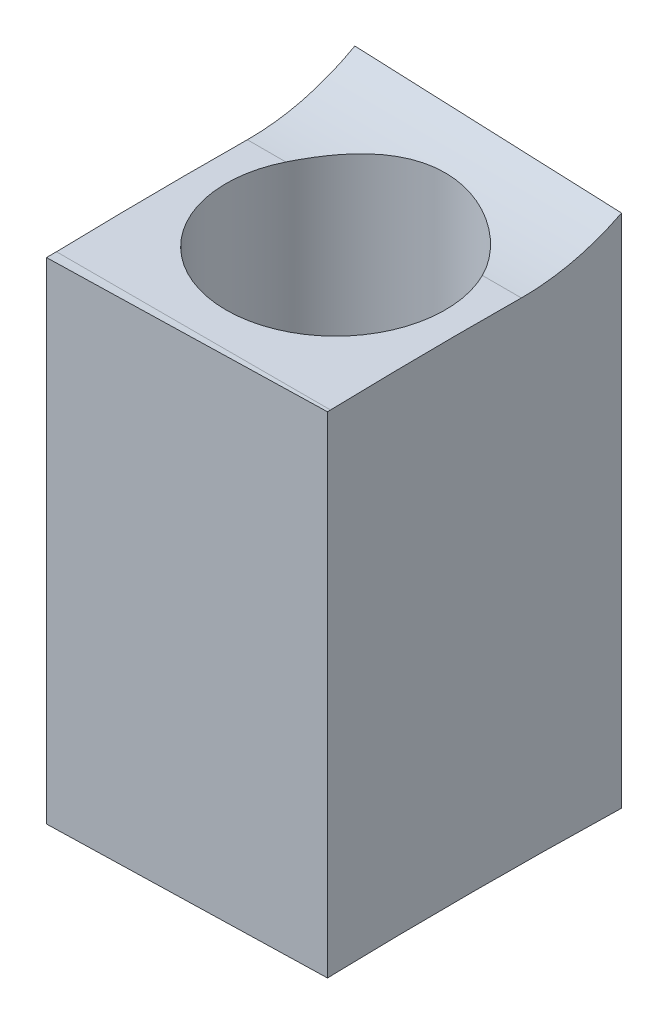
ISO-10303-21;
HEADER;
FILE_DESCRIPTION(('STEP AP214'),'2;1');
FILE_NAME('part.step','',(''),(''),'','','');
FILE_SCHEMA(('AUTOMOTIVE_DESIGN { 1 0 10303 214 1 1 1 1 }'));
ENDSEC;
DATA;
#1=APPLICATION_CONTEXT('core data for automotive mechanical design processes');
#2=APPLICATION_PROTOCOL_DEFINITION('international standard','automotive_design',2000,#1);
#3=PRODUCT_CONTEXT('',#1,'mechanical');
#4=PRODUCT('Part','Part','',(#3));
#5=PRODUCT_RELATED_PRODUCT_CATEGORY('part','',(#4));
#6=PRODUCT_DEFINITION_FORMATION('','',#4);
#7=PRODUCT_DEFINITION_CONTEXT('part definition',#1,'design');
#8=PRODUCT_DEFINITION('design','',#6,#7);
#9=PRODUCT_DEFINITION_SHAPE('','',#8);
#10=(LENGTH_UNIT() NAMED_UNIT(*) SI_UNIT(.MILLI.,.METRE.));
#11=(NAMED_UNIT(*) PLANE_ANGLE_UNIT() SI_UNIT($,.RADIAN.));
#12=(NAMED_UNIT(*) SI_UNIT($,.STERADIAN.) SOLID_ANGLE_UNIT());
#13=UNCERTAINTY_MEASURE_WITH_UNIT(LENGTH_MEASURE(1.E-05),#10,'distance_accuracy_value','');
#14=(GEOMETRIC_REPRESENTATION_CONTEXT(3) GLOBAL_UNCERTAINTY_ASSIGNED_CONTEXT((#13)) GLOBAL_UNIT_ASSIGNED_CONTEXT((#10,
#11,#12)) REPRESENTATION_CONTEXT('',''));
#15=CARTESIAN_POINT('',(0.,0.,0.));
#16=DIRECTION('',(0.,0.,1.));
#17=DIRECTION('',(1.,0.,0.));
#18=AXIS2_PLACEMENT_3D('',#15,#16,#17);
#19=CARTESIAN_POINT('',(-140.97,11.3649926426397,2.12160022973724E-13));
#20=DIRECTION('',(0.,1.,0.));
#21=DIRECTION('',(0.,0.,1.));
#22=AXIS2_PLACEMENT_3D('',#19,#20,#21);
#23=PLANE('',#22);
#24=CARTESIAN_POINT('',(-133.35,11.3649926426397,0.));
#25=DIRECTION('',(0.,1.,0.));
#26=DIRECTION('',(0.,0.,1.));
#27=AXIS2_PLACEMENT_3D('',#24,#25,#26);
#28=CIRCLE('',#27,2.53999999999998);
#29=CARTESIAN_POINT('',(-135.627407566636,11.3649926426397,-1.12472875637992));
#30=VERTEX_POINT('',#29);
#31=CARTESIAN_POINT('',(-131.072592433364,11.3649926426397,-1.12472875637992));
#32=VERTEX_POINT('',#31);
#33=EDGE_CURVE('E1041',#30,#32,#28,.T.);
#34=ORIENTED_EDGE('',*,*,#33,.F.);
#35=DIRECTION('',(1.,0.,0.));
#36=VECTOR('',#35,1.);
#37=CARTESIAN_POINT('',(-140.97,11.3649926426397,-1.12472875637992));
#38=LINE('',#37,#36);
#39=CARTESIAN_POINT('',(-136.520367016151,11.3649926426397,-1.12472875637992));
#40=VERTEX_POINT('',#39);
#41=EDGE_CURVE('E1098',#40,#30,#38,.T.);
#42=ORIENTED_EDGE('',*,*,#41,.F.);
#43=CARTESIAN_POINT('',(0.,11.3649926426397,0.));
#44=DIRECTION('',(0.,1.,0.));
#45=DIRECTION('',(0.,0.,1.));
#46=AXIS2_PLACEMENT_3D('',#43,#44,#45);
#47=CIRCLE('',#46,136.525);
#48=CARTESIAN_POINT('',(-136.484243401375,11.3649926426396,3.33570504602761));
#49=VERTEX_POINT('',#48);
#50=EDGE_CURVE('E1094',#40,#49,#47,.T.);
#51=ORIENTED_EDGE('',*,*,#50,.T.);
#52=DIRECTION('',(1.,0.,0.));
#53=VECTOR('',#52,1.);
#54=CARTESIAN_POINT('',(-140.97,11.3649926426396,3.33570504602761));
#55=LINE('',#54,#53);
#56=CARTESIAN_POINT('',(-130.132254636758,11.3649926426396,3.33570504602761));
#57=VERTEX_POINT('',#56);
#58=EDGE_CURVE('E1044',#49,#57,#55,.T.);
#59=ORIENTED_EDGE('',*,*,#58,.T.);
#60=CARTESIAN_POINT('',(0.,11.3649926426397,0.));
#61=DIRECTION('',(0.,1.,0.));
#62=DIRECTION('',(0.,0.,1.));
#63=AXIS2_PLACEMENT_3D('',#60,#61,#62);
#64=CIRCLE('',#63,130.175);
#65=CARTESIAN_POINT('',(-130.170141008699,11.3649926426397,-1.12472875637992));
#66=VERTEX_POINT('',#65);
#67=EDGE_CURVE('E1035',#66,#57,#64,.T.);
#68=ORIENTED_EDGE('',*,*,#67,.F.);
#69=EDGE_CURVE('E1095',#32,#66,#38,.T.);
#70=ORIENTED_EDGE('',*,*,#69,.F.);
#71=EDGE_LOOP('',(#34,#42,#51,#59,#68,#70));
#72=FACE_BOUND('',#71,.T.);
#73=ADVANCED_FACE('F957',(#72),#23,.T.);
#74=CARTESIAN_POINT('',(-133.35,25.4,0.));
#75=DIRECTION('',(0.,-1.,0.));
#76=DIRECTION('',(0.,0.,-1.));
#77=AXIS2_PLACEMENT_3D('',#74,#75,#76);
#78=CYLINDRICAL_SURFACE('',#77,2.53999999999998);
#79=ORIENTED_EDGE('',*,*,#33,.T.);
#80=CARTESIAN_POINT('',(-133.35,11.5801402748347,-2.53999999999998));
#81=CARTESIAN_POINT('',(-133.489774137144,11.5801305590268,-2.53999040533164));
#82=CARTESIAN_POINT('',(-133.629757827464,11.5764803282047,-2.52840243560373));
#83=CARTESIAN_POINT('',(-133.905830418461,11.562553519904,-2.48240515171614));
#84=CARTESIAN_POINT('',(-134.041907862156,11.5522591907938,-2.4479346933045));
#85=CARTESIAN_POINT('',(-134.305797903615,11.5270518636434,-2.35742334855067));
#86=CARTESIAN_POINT('',(-134.433632526065,11.5121518474014,-2.30144298453229));
#87=CARTESIAN_POINT('',(-134.678212653978,11.4805123611901,-2.16950801297298));
#88=CARTESIAN_POINT('',(-134.794961169526,11.4637733932085,-2.0935588485648));
#89=CARTESIAN_POINT('',(-135.017909180039,11.4311826078722,-1.92097161791698));
#90=CARTESIAN_POINT('',(-135.123691403957,11.4153720099009,-1.8237851768407));
#91=CARTESIAN_POINT('',(-135.317677741705,11.3888518228688,-1.61257291249111));
#92=CARTESIAN_POINT('',(-135.40588343651,11.3781417749026,-1.49854860536014));
#93=CARTESIAN_POINT('',(-135.56044601755,11.3654117935713,-1.25913899581737));
#94=CARTESIAN_POINT('',(-135.627187793943,11.3632298953813,-1.1340120783334));
#95=CARTESIAN_POINT('',(-135.738821113147,11.3697993323867,-0.874659353051798));
#96=CARTESIAN_POINT('',(-135.783727597472,11.3785431766177,-0.740439839016499));
#97=CARTESIAN_POINT('',(-135.847973658182,11.4073907776832,-0.478097247090377));
#98=CARTESIAN_POINT('',(-135.868990823324,11.4265848137544,-0.350281441296535));
#99=CARTESIAN_POINT('',(-135.89145223995,11.4758212781879,-0.0950454129272551));
#100=CARTESIAN_POINT('',(-135.892896492607,11.5058637059,0.0323748096718966));
#101=CARTESIAN_POINT('',(-135.877372269699,11.5756356948728,0.281911635229959));
#102=CARTESIAN_POINT('',(-135.86059008454,11.6152640887161,0.404068876194963));
#103=CARTESIAN_POINT('',(-135.81058695655,11.7029105755913,0.641779505340714));
#104=CARTESIAN_POINT('',(-135.777361621862,11.7509309078367,0.757331119999226));
#105=CARTESIAN_POINT('',(-135.691920854942,11.859131781195,0.992100489034013));
#106=CARTESIAN_POINT('',(-135.638038056027,11.9200661126171,1.11035920522736));
#107=CARTESIAN_POINT('',(-135.514574306174,12.0474185247218,1.33517615412265));
#108=CARTESIAN_POINT('',(-135.444979392533,12.1138414493988,1.44172385374207));
#109=CARTESIAN_POINT('',(-135.278220976172,12.2613716601777,1.66001163116803));
#110=CARTESIAN_POINT('',(-135.178358860913,12.3429991732633,1.76934031883085));
#111=CARTESIAN_POINT('',(-134.960601593178,12.504943931411,1.96963694851819));
#112=CARTESIAN_POINT('',(-134.842701704637,12.5852608262053,2.060600053815));
#113=CARTESIAN_POINT('',(-134.617692744727,12.7204927764356,2.20411305644432));
#114=CARTESIAN_POINT('',(-134.514148491088,12.7770510697038,2.26069945596008));
#115=CARTESIAN_POINT('',(-134.296277052084,12.8806522921458,2.36017754139071));
#116=CARTESIAN_POINT('',(-134.181972553254,12.9277146113573,2.4030972394702));
#117=CARTESIAN_POINT('',(-133.972137912275,12.9968491751983,2.46443435486729));
#118=CARTESIAN_POINT('',(-133.878711916091,13.0222099523155,2.48626293205306));
#119=CARTESIAN_POINT('',(-133.687632638,13.0610630630849,2.51931867356636));
#120=CARTESIAN_POINT('',(-133.589986101204,13.0745736492993,2.53056214384447));
#121=CARTESIAN_POINT('',(-133.392562023033,13.0878022485305,2.541574158814));
#122=CARTESIAN_POINT('',(-133.292776098547,13.0874488929168,2.54128332728426));
#123=CARTESIAN_POINT('',(-133.094931690226,13.0728313021907,2.52910853272517));
#124=CARTESIAN_POINT('',(-132.996874757335,13.0585551659326,2.51721465144551));
#125=CARTESIAN_POINT('',(-132.788561243328,13.0146727383882,2.47981079344584));
#126=CARTESIAN_POINT('',(-132.679152112285,12.9828305548844,2.45229110290641));
#127=CARTESIAN_POINT('',(-132.468467260088,12.9075789780679,2.38470327946712));
#128=CARTESIAN_POINT('',(-132.367211447273,12.8641423260775,2.34460553604981));
#129=CARTESIAN_POINT('',(-132.131829155496,12.749839093771,2.23407310517439));
#130=CARTESIAN_POINT('',(-132.002207095845,12.6751938712518,2.15800130174267));
#131=CARTESIAN_POINT('',(-131.760424614274,12.5199902689609,1.98666606644497));
#132=CARTESIAN_POINT('',(-131.648287885412,12.4394240797946,1.89137698859371));
#133=CARTESIAN_POINT('',(-131.439039490235,12.2761268137448,1.68003897167672));
#134=CARTESIAN_POINT('',(-131.342434038987,12.1933980201867,1.56348520423342));
#135=CARTESIAN_POINT('',(-131.170195915477,12.0332869303372,1.31268103511606));
#136=CARTESIAN_POINT('',(-131.094535291176,11.9558976128497,1.17845457532452));
#137=CARTESIAN_POINT('',(-130.977164674597,11.8221441587322,0.915778100473246));
#138=CARTESIAN_POINT('',(-130.932032816276,11.7643744232231,0.789581692837605));
#139=CARTESIAN_POINT('',(-130.861752639875,11.6586586640589,0.527786472712457));
#140=CARTESIAN_POINT('',(-130.836594006562,11.6107075790396,0.392192552992179));
#141=CARTESIAN_POINT('',(-130.808698523048,11.5266320167139,0.114100762202907));
#142=CARTESIAN_POINT('',(-130.806104325376,11.4905841671185,-0.0284353126448869));
#143=CARTESIAN_POINT('',(-130.825493383945,11.4321281553367,-0.314636513062298));
#144=CARTESIAN_POINT('',(-130.847463380898,11.4097126447511,-0.458300987996079));
#145=CARTESIAN_POINT('',(-130.912395366596,11.3800486113695,-0.725611511346704));
#146=CARTESIAN_POINT('',(-130.952807905702,11.3714130871605,-0.849732560429533));
#147=CARTESIAN_POINT('',(-131.052326967335,11.3635917835181,-1.09053583326177));
#148=CARTESIAN_POINT('',(-131.111433774441,11.3644061479448,-1.20721794373751));
#149=CARTESIAN_POINT('',(-131.246280114003,11.3734446032365,-1.42924782129311));
#150=CARTESIAN_POINT('',(-131.32192304465,11.3816264858342,-1.53465633080222));
#151=CARTESIAN_POINT('',(-131.488046882824,11.4028788605753,-1.73246258969894));
#152=CARTESIAN_POINT('',(-131.578531110159,11.4159504473232,-1.82485741947698));
#153=CARTESIAN_POINT('',(-131.779397202896,11.4453833772517,-2.0009817604865));
#154=CARTESIAN_POINT('',(-131.890753196551,11.461915999123,-2.08357364276249));
#155=CARTESIAN_POINT('',(-132.12552961673,11.4943373307467,-2.22966900132229));
#156=CARTESIAN_POINT('',(-132.248959707553,11.5102255100488,-2.29315701814712));
#157=CARTESIAN_POINT('',(-132.510051569263,11.5389432798317,-2.40141309745329));
#158=CARTESIAN_POINT('',(-132.648082693622,11.551627474251,-2.44534380759793));
#159=CARTESIAN_POINT('',(-132.859188927557,11.5658033916716,-2.49317573573641));
#160=CARTESIAN_POINT('',(-132.930175840945,11.5697191028787,-2.5061058800032));
#161=CARTESIAN_POINT('',(-133.07305707682,11.57575784178,-2.52588335421378));
#162=CARTESIAN_POINT('',(-133.144950791416,11.5778820117371,-2.53273456015338));
#163=CARTESIAN_POINT('',(-133.261283715701,11.5797796149456,-2.53883942305488));
#164=CARTESIAN_POINT('',(-133.305631300279,11.5801433589371,-2.54000304564896));
#165=CARTESIAN_POINT('',(-133.35,11.5801402748347,-2.53999999999998));
#166=B_SPLINE_CURVE_WITH_KNOTS('',3,(#80,#81,#82,#83,#84,#85,#86,#87,#88,#89,#90,#91,#92,#93,
#94,#95,#96,#97,#98,#99,#100,#101,#102,#103,#104,#105,#106,#107,#108,#109,#110,#111,#112,#113,
#114,#115,#116,#117,#118,#119,#120,#121,#122,#123,#124,#125,#126,#127,#128,#129,#130,#131,#132,
#133,#134,#135,#136,#137,#138,#139,#140,#141,#142,#143,#144,#145,#146,#147,#148,#149,#150,#151,
#152,#153,#154,#155,#156,#157,#158,#159,#160,#161,#162,#163,#164,#165),.UNSPECIFIED.,.T.,.F.,(4,
2,2,2,2,2,2,2,2,2,2,2,2,2,2,2,2,2,2,2,2,2,2,2,2,2,2,2,2,2,2,2,2,2,2,2,2,2,2,2,2,2,4),(0.,
0.419171646418358,0.839467893541933,1.25859011381615,1.67759820720509,2.1090743766244,
2.540511718033,2.96371429703728,3.38662687683008,3.77753601545947,4.16844513065484,
4.55539608708564,4.94245045138999,5.37143709487362,5.80080647212805,6.30607393304219,
6.81147428723948,7.20287218831838,7.59346261225419,7.89003003305491,8.18613985198362,
8.48377418044855,8.78166314892409,9.1314040477119,9.48197454454403,9.98274948906855,
10.4841972073637,10.99962889533,11.514369357932,11.9504231598981,12.3862516137612,
12.8248333911119,13.2631785445726,13.6537390266605,14.0443054544437,14.4326484769982,
14.8210784857226,15.2380858189972,15.6554297059883,16.0892385757684,16.3057967089381,
16.5222166629033,16.6552749045156),.UNSPECIFIED.);
#167=EDGE_CURVE('E1043',#32,#30,#166,.T.);
#168=ORIENTED_EDGE('',*,*,#167,.T.);
#169=EDGE_LOOP('',(#79,#168));
#170=FACE_BOUND('',#169,.T.);
#171=CARTESIAN_POINT('',(-133.35,0.,0.));
#172=DIRECTION('',(0.,-1.,0.));
#173=DIRECTION('',(0.,0.,1.));
#174=AXIS2_PLACEMENT_3D('',#171,#172,#173);
#175=CIRCLE('',#174,2.53999999999998);
#176=CARTESIAN_POINT('',(-133.35,0.,2.53999999999998));
#177=VERTEX_POINT('',#176);
#178=EDGE_CURVE('E1050',#177,#177,#175,.T.);
#179=ORIENTED_EDGE('',*,*,#178,.T.);
#180=EDGE_LOOP('',(#179));
#181=FACE_BOUND('',#180,.T.);
#182=ADVANCED_FACE('F1055',(#170,#181),#78,.F.);
#183=CARTESIAN_POINT('',(-140.97,16.1274926426397,-1.12472875637984));
#184=DIRECTION('',(1.,0.,0.));
#185=DIRECTION('',(0.,0.,-1.));
#186=AXIS2_PLACEMENT_3D('',#183,#184,#185);
#187=CYLINDRICAL_SURFACE('',#186,4.7625);
#188=CARTESIAN_POINT('',(-42.9516583332053,16.1274926426397,-1.12472875637984));
#189=DIRECTION('',(-0.0261769483078736,0.,0.999657324975557));
#190=DIRECTION('',(0.999657324975557,0.,0.0261769483078736));
#191=AXIS2_PLACEMENT_3D('',#188,#189,#190);
#192=ELLIPSE('',#191,181.934881942198,4.7625);
#193=CARTESIAN_POINT('',(-136.478216292288,12.0429586721191,-3.57380786773244));
#194=VERTEX_POINT('',#193);
#195=CARTESIAN_POINT('',(-130.130392278693,11.9477824776146,-3.40758424597744));
#196=VERTEX_POINT('',#195);
#197=EDGE_CURVE('E1016',#194,#196,#192,.T.);
#198=ORIENTED_EDGE('',*,*,#197,.F.);
#199=CARTESIAN_POINT('',(-136.451070508352,19.4950886880406,-4.49232480178079));
#200=CARTESIAN_POINT('',(-136.447952615226,19.4004068125719,-4.58702691016241));
#201=CARTESIAN_POINT('',(-136.444868266467,19.3017120408299,-4.67771448429911));
#202=CARTESIAN_POINT('',(-136.4388366071,19.0970424502135,-4.85046028836146));
#203=CARTESIAN_POINT('',(-136.435889290441,18.9910679533088,-4.93251889952567));
#204=CARTESIAN_POINT('',(-136.430203278788,18.7726499893024,-5.08736263673596));
#205=CARTESIAN_POINT('',(-136.427464444145,18.660210942575,-5.16015399266636));
#206=CARTESIAN_POINT('',(-136.422258058328,18.4296003814945,-5.29601310278892));
#207=CARTESIAN_POINT('',(-136.419790503606,18.3114289421524,-5.35908098417212));
#208=CARTESIAN_POINT('',(-136.415184970939,18.0701527012153,-5.47506216636775));
#209=CARTESIAN_POINT('',(-136.413047094429,17.9470463958937,-5.52797234310444));
#210=CARTESIAN_POINT('',(-136.409152589972,17.6967629303313,-5.6232544669249));
#211=CARTESIAN_POINT('',(-136.407396103168,17.5695842829356,-5.66562251348886));
#212=CARTESIAN_POINT('',(-136.404308823968,17.3121779398713,-5.73947085519832));
#213=CARTESIAN_POINT('',(-136.402977788736,17.1819520292176,-5.77095736206461));
#214=CARTESIAN_POINT('',(-136.400771966363,16.9192588842423,-5.82286079936625));
#215=CARTESIAN_POINT('',(-136.399897347686,16.7867908409433,-5.84327364259472));
#216=CARTESIAN_POINT('',(-136.398627042529,16.5207281760041,-5.87285159228658));
#217=CARTESIAN_POINT('',(-136.398230906982,16.3871347293697,-5.88202724521889));
#218=CARTESIAN_POINT('',(-136.397925589575,16.1196017681208,-5.88910272208295));
#219=CARTESIAN_POINT('',(-136.398016587659,15.9856621438936,-5.88699837924928));
#220=CARTESIAN_POINT('',(-136.398683948114,15.7184608590036,-5.87151669726734));
#221=CARTESIAN_POINT('',(-136.399260193921,15.5851990432557,-5.85814206538828));
#222=CARTESIAN_POINT('',(-136.40088306448,15.3202587769564,-5.82022846218996));
#223=CARTESIAN_POINT('',(-136.40192986524,15.1885809378226,-5.79568531330926));
#224=CARTESIAN_POINT('',(-136.405740018278,14.7975731948264,-5.70556834084457));
#225=CARTESIAN_POINT('',(-136.409174244328,14.5418626710235,-5.62348301798864));
#226=CARTESIAN_POINT('',(-136.417507536408,14.0478824398872,-5.41754087762888));
#227=CARTESIAN_POINT('',(-136.422406603812,13.8096127489167,-5.29368402093571));
#228=CARTESIAN_POINT('',(-136.430497143381,13.4704114248379,-5.07938572575286));
#229=CARTESIAN_POINT('',(-136.433320398368,13.3602912128607,-5.00312279220522));
#230=CARTESIAN_POINT('',(-136.439147451389,13.1468772242993,-4.84161131198386));
#231=CARTESIAN_POINT('',(-136.442151181662,13.0435809158337,-4.75636612881716));
#232=CARTESIAN_POINT('',(-136.448270206945,12.8445160189192,-4.57746557911666));
#233=CARTESIAN_POINT('',(-136.45138553002,12.7487493438799,-4.4838080877412));
#234=CARTESIAN_POINT('',(-136.457654065824,12.5654747710411,-4.28879739056907));
#235=CARTESIAN_POINT('',(-136.46080726416,12.4779638413882,-4.18744703478198));
#236=CARTESIAN_POINT('',(-136.467084480793,12.3116932351567,-3.97762538758907));
#237=CARTESIAN_POINT('',(-136.470208463627,12.2329431794517,-3.869146471727));
#238=CARTESIAN_POINT('',(-136.476352990165,12.0848902128412,-3.64597764938229));
#239=CARTESIAN_POINT('',(-136.479373571605,12.015583827287,-3.53129004910699));
#240=CARTESIAN_POINT('',(-136.485248477515,11.8868426591042,-3.29641893296185));
#241=CARTESIAN_POINT('',(-136.488102713181,11.8274131184296,-3.17623254158679));
#242=CARTESIAN_POINT('',(-136.493582216723,11.7189137716147,-2.93131957313633));
#243=CARTESIAN_POINT('',(-136.496207570122,11.6698400861691,-2.80659471677163));
#244=CARTESIAN_POINT('',(-136.501141871921,11.5830072552342,-2.55528005439978));
#245=CARTESIAN_POINT('',(-136.503454845055,11.545094825905,-2.42874325936887));
#246=CARTESIAN_POINT('',(-136.507766334441,11.4799068704214,-2.17295317570505));
#247=CARTESIAN_POINT('',(-136.509764851393,11.4526313206063,-2.04369989311538));
#248=CARTESIAN_POINT('',(-136.513414827577,11.4088980573806,-1.78329085635949));
#249=CARTESIAN_POINT('',(-136.515066075948,11.3924469036851,-1.65213399771295));
#250=CARTESIAN_POINT('',(-136.517999025787,11.370487043849,-1.38889562540496));
#251=CARTESIAN_POINT('',(-136.519280704895,11.3649789996838,-1.25681405629049));
#252=CARTESIAN_POINT('',(-136.520367016151,11.3649926426397,-1.12472875637992));
#253=B_SPLINE_CURVE_WITH_KNOTS('',3,(#199,#200,#201,#202,#203,#204,#205,#206,#207,#208,#209,
#210,#211,#212,#213,#214,#215,#216,#217,#218,#219,#220,#221,#222,#223,#224,#225,#226,#227,#228,
#229,#230,#231,#232,#233,#234,#235,#236,#237,#238,#239,#240,#241,#242,#243,#244,#245,#246,#247,
#248,#249,#250,#251,#252),.UNSPECIFIED.,.F.,.F.,(4,2,2,2,2,2,2,2,2,2,2,2,2,2,2,2,2,2,2,2,2,2,2,
2,2,2,4),(0.,0.401730642081915,0.80344352773037,1.20488492091714,1.60632106247464,
2.00788047152683,2.409588234765,2.81106630309802,3.21269245335414,3.61394137480853,
4.01533852551304,4.41663928290678,4.81809026958719,5.61978649559305,6.42148347373892,
6.82302419526842,7.22441508602687,7.62590764965578,8.02725218980788,8.4290332096778,
8.83066599909839,9.23251127170541,9.63420574473339,10.0300942938491,10.4259819623461,
10.8221093231283,11.2182606458896),.UNSPECIFIED.);
#254=EDGE_CURVE('E1078',#194,#40,#253,.T.);
#255=ORIENTED_EDGE('',*,*,#254,.T.);
#256=ORIENTED_EDGE('',*,*,#41,.T.);
#257=ORIENTED_EDGE('',*,*,#167,.F.);
#258=ORIENTED_EDGE('',*,*,#69,.T.);
#259=CARTESIAN_POINT('',(-130.097462092369,19.4950886880406,-4.49232480178079));
#260=CARTESIAN_POINT('',(-130.094192009814,19.4004091069371,-4.587024602308));
#261=CARTESIAN_POINT('',(-130.090957093606,19.3017167725189,-4.67771013995367));
#262=CARTESIAN_POINT('',(-130.084630955571,19.0970520928856,-4.8504524996695));
#263=CARTESIAN_POINT('',(-130.081539727451,18.9910800669492,-4.93250969976958));
#264=CARTESIAN_POINT('',(-130.07557603343,18.7726665251111,-5.08735152578895));
#265=CARTESIAN_POINT('',(-130.072703421831,18.6602294071688,-5.16014234943486));
#266=CARTESIAN_POINT('',(-130.067242699074,18.4296223474737,-5.29600092698724));
#267=CARTESIAN_POINT('',(-130.064654584167,18.311452481267,-5.3590688089767));
#268=CARTESIAN_POINT('',(-130.059823997775,18.0701786377911,-5.47505055878217));
#269=CARTESIAN_POINT('',(-130.057581633394,17.9470731464218,-5.5279612814282));
#270=CARTESIAN_POINT('',(-130.053496761611,17.6967907327375,-5.62324476059497));
#271=CARTESIAN_POINT('',(-130.051654402239,17.5696123230616,-5.66561361671161));
#272=CARTESIAN_POINT('',(-130.048416172319,17.3122060761688,-5.73946363462126));
#273=CARTESIAN_POINT('',(-130.047020046459,17.1819800285881,-5.7709510230447));
#274=CARTESIAN_POINT('',(-130.044706337997,16.9192861526372,-5.82285621860721));
#275=CARTESIAN_POINT('',(-130.043788932078,16.7868175151756,-5.84326993882059));
#276=CARTESIAN_POINT('',(-130.042456504641,16.5207613377183,-5.87284864323656));
#277=CARTESIAN_POINT('',(-130.042040982075,16.3871750479321,-5.88202484635201));
#278=CARTESIAN_POINT('',(-130.041720637759,16.1196562641624,-5.88910261359721));
#279=CARTESIAN_POINT('',(-130.041816004725,15.9857236605171,-5.88700001150617));
#280=CARTESIAN_POINT('',(-130.042515773722,15.718536301756,-5.87152299811448));
#281=CARTESIAN_POINT('',(-130.04312005353,15.5852813916114,-5.85815129326227));
#282=CARTESIAN_POINT('',(-130.04482193041,15.3203548335308,-5.82024476706954));
#283=CARTESIAN_POINT('',(-130.045919712074,15.1886837969775,-5.79570576859405));
#284=CARTESIAN_POINT('',(-130.049915366043,14.7977057165116,-5.70560535573897));
#285=CARTESIAN_POINT('',(-130.053516753337,14.5420175403841,-5.62353597858792));
#286=CARTESIAN_POINT('',(-130.062255656872,14.0480789775841,-5.41763441183327));
#287=CARTESIAN_POINT('',(-130.067393174978,13.809828612094,-5.29380217149954));
#288=CARTESIAN_POINT('',(-130.075877688738,13.4706452581853,-5.07954259281016));
#289=CARTESIAN_POINT('',(-130.078838550221,13.3605262487493,-5.00329022801835));
#290=CARTESIAN_POINT('',(-130.084949639713,13.1471136844836,-4.84180066347514));
#291=CARTESIAN_POINT('',(-130.088099796671,13.0438175988425,-4.75656682599465));
#292=CARTESIAN_POINT('',(-130.094517143941,12.8447518823936,-4.57768954173313));
#293=CARTESIAN_POINT('',(-130.09778436375,12.7489841681701,-4.48404396639677));
#294=CARTESIAN_POINT('',(-130.104358577909,12.5657060844006,-4.28905745627848));
#295=CARTESIAN_POINT('',(-130.107665557153,12.478192684107,-4.18771937082601));
#296=CARTESIAN_POINT('',(-130.114249203723,12.3119094065516,-3.97791460284898));
#297=CARTESIAN_POINT('',(-130.117525831386,12.2331498011915,-3.86943977853076));
#298=CARTESIAN_POINT('',(-130.123970640818,12.085077475554,-3.64627801231976));
#299=CARTESIAN_POINT('',(-130.127138862147,12.0157612810246,-3.53159337684874));
#300=CARTESIAN_POINT('',(-130.133300969957,11.8870003393156,-3.2967269702767));
#301=CARTESIAN_POINT('',(-130.136294763396,11.8275608297163,-3.17654232534552));
#302=CARTESIAN_POINT('',(-130.142042239141,11.7190415057555,-2.93163147681629));
#303=CARTESIAN_POINT('',(-130.144796011133,11.6699578120858,-2.80690699445251));
#304=CARTESIAN_POINT('',(-130.14997216872,11.5830978365099,-2.55557019063761));
#305=CARTESIAN_POINT('',(-130.152398726034,11.5451700520927,-2.42901028411291));
#306=CARTESIAN_POINT('',(-130.156921929212,11.479955426238,-2.17317180752624));
#307=CARTESIAN_POINT('',(-130.15901857578,11.4526685620907,-2.04389324326706));
#308=CARTESIAN_POINT('',(-130.162847747056,11.4089169065678,-1.7834314629842));
#309=CARTESIAN_POINT('',(-130.164580049011,11.3924587226519,-1.65224713389665));
#310=CARTESIAN_POINT('',(-130.167656915625,11.3704894287272,-1.38895279465749));
#311=CARTESIAN_POINT('',(-130.16900145674,11.3649789833553,-1.25684272879299));
#312=CARTESIAN_POINT('',(-130.170141008699,11.3649926426397,-1.12472875637992));
#313=B_SPLINE_CURVE_WITH_KNOTS('',3,(#259,#260,#261,#262,#263,#264,#265,#266,#267,#268,#269,
#270,#271,#272,#273,#274,#275,#276,#277,#278,#279,#280,#281,#282,#283,#284,#285,#286,#287,#288,
#289,#290,#291,#292,#293,#294,#295,#296,#297,#298,#299,#300,#301,#302,#303,#304,#305,#306,#307,
#308,#309,#310,#311,#312),.UNSPECIFIED.,.F.,.F.,(4,2,2,2,2,2,2,2,2,2,2,2,2,2,2,2,2,2,2,2,2,2,2,
2,2,2,4),(0.,0.401731800801046,0.803445993346617,1.20489007556783,1.60632886900369,
2.00789176837916,2.40960302253158,2.81108402599672,3.21271310222166,3.61394088655157,
4.01531688858598,4.41659652145814,4.81802637682189,5.61965136254305,6.42127732201623,
6.82280599970594,7.22418489305237,7.62566564133418,8.02699839881019,8.42879722519426,
8.8304478273819,9.23231074874356,9.63402286315958,10.0299968358423,10.4259699634299,
10.8221844829531,11.2184230559187),.UNSPECIFIED.);
#314=EDGE_CURVE('E1033',#196,#66,#313,.T.);
#315=ORIENTED_EDGE('',*,*,#314,.F.);
#316=EDGE_LOOP('',(#198,#255,#256,#257,#258,#315));
#317=FACE_BOUND('',#316,.T.);
#318=ADVANCED_FACE('F1052',(#317),#187,.F.);
#319=CARTESIAN_POINT('',(0.,0.,0.));
#320=DIRECTION('',(0.,-1.,0.));
#321=DIRECTION('',(0.,0.,-1.));
#322=AXIS2_PLACEMENT_3D('',#319,#320,#321);
#323=PLANE('',#322);
#324=ORIENTED_EDGE('',*,*,#178,.F.);
#325=EDGE_LOOP('',(#324));
#326=FACE_BOUND('',#325,.T.);
#327=CARTESIAN_POINT('',(0.,0.,0.));
#328=DIRECTION('',(0.,-1.,0.));
#329=DIRECTION('',(0.,0.,-1.));
#330=AXIS2_PLACEMENT_3D('',#327,#328,#329);
#331=CIRCLE('',#330,130.175);
#332=CARTESIAN_POINT('',(-130.130392278693,0.,3.4075842459774));
#333=VERTEX_POINT('',#332);
#334=CARTESIAN_POINT('',(-130.130392278693,0.,-3.40758424597744));
#335=VERTEX_POINT('',#334);
#336=EDGE_CURVE('E1026',#333,#335,#331,.T.);
#337=ORIENTED_EDGE('',*,*,#336,.F.);
#338=DIRECTION('',(-0.999657324975557,0.,0.0261769483078732));
#339=VECTOR('',#338,1.);
#340=CARTESIAN_POINT('',(0.,0.,0.));
#341=LINE('',#340,#339);
#342=CARTESIAN_POINT('',(-136.478216292288,0.,3.57380786773239));
#343=VERTEX_POINT('',#342);
#344=EDGE_CURVE('E1097',#333,#343,#341,.T.);
#345=ORIENTED_EDGE('',*,*,#344,.T.);
#346=CARTESIAN_POINT('',(0.,0.,0.));
#347=DIRECTION('',(0.,-1.,0.));
#348=DIRECTION('',(0.,0.,-1.));
#349=AXIS2_PLACEMENT_3D('',#346,#347,#348);
#350=CIRCLE('',#349,136.525);
#351=CARTESIAN_POINT('',(-136.478216292288,0.,-3.57380786773244));
#352=VERTEX_POINT('',#351);
#353=EDGE_CURVE('E1028',#343,#352,#350,.T.);
#354=ORIENTED_EDGE('',*,*,#353,.T.);
#355=DIRECTION('',(-0.999657324975557,0.,-0.0261769483078736));
#356=VECTOR('',#355,1.);
#357=CARTESIAN_POINT('',(0.,0.,0.));
#358=LINE('',#357,#356);
#359=EDGE_CURVE('E967',#335,#352,#358,.T.);
#360=ORIENTED_EDGE('',*,*,#359,.F.);
#361=EDGE_LOOP('',(#337,#345,#354,#360));
#362=FACE_BOUND('',#361,.T.);
#363=ADVANCED_FACE('F1024',(#326,#362),#323,.T.);
#364=CARTESIAN_POINT('',(-140.97,16.1274926426396,3.33570504602769));
#365=DIRECTION('',(1.,0.,0.));
#366=DIRECTION('',(0.,0.,-1.));
#367=AXIS2_PLACEMENT_3D('',#364,#365,#366);
#368=CYLINDRICAL_SURFACE('',#367,4.7625);
#369=CARTESIAN_POINT('',(-136.484243401375,11.3649926426396,3.33570504602761));
#370=CARTESIAN_POINT('',(-136.480970234541,11.3649782290441,3.46971190396381));
#371=CARTESIAN_POINT('',(-136.477495852723,11.370648043557,3.60371150688738));
#372=CARTESIAN_POINT('',(-136.470182399728,11.3932494074558,3.87074075480306));
#373=CARTESIAN_POINT('',(-136.466343347912,11.4101803592355,4.0037704508875));
#374=CARTESIAN_POINT('',(-136.458340891568,11.4551807007977,4.26782147580663));
#375=CARTESIAN_POINT('',(-136.454177728288,11.483241868481,4.39884421317926));
#376=CARTESIAN_POINT('',(-136.445575208099,11.5502963125506,4.65805079889167));
#377=CARTESIAN_POINT('',(-136.441135854153,11.5892894716786,4.78623467766554));
#378=CARTESIAN_POINT('',(-136.43203879646,11.6779421810724,5.03888904161948));
#379=CARTESIAN_POINT('',(-136.4273810359,11.7276045188241,5.16335854666521));
#380=CARTESIAN_POINT('',(-136.417913896637,11.8372557333465,5.40771203205379));
#381=CARTESIAN_POINT('',(-136.413104462551,11.89724841875,5.52759430116182));
#382=CARTESIAN_POINT('',(-136.40341234484,12.027085557816,5.76181035324847));
#383=CARTESIAN_POINT('',(-136.398529702791,12.0969245958123,5.87614714018521));
#384=CARTESIAN_POINT('',(-136.388765746835,12.2460117014369,6.09857378694572));
#385=CARTESIAN_POINT('',(-136.383884434084,12.3252632331636,6.20666132495128));
#386=CARTESIAN_POINT('',(-136.374206208276,12.4926101501003,6.41579838525046));
#387=CARTESIAN_POINT('',(-136.369409312476,12.580707319378,6.51684648077702));
#388=CARTESIAN_POINT('',(-136.359982781774,12.7651421984638,6.71119902508074));
#389=CARTESIAN_POINT('',(-136.355353209133,12.8614829317029,6.80450060779322));
#390=CARTESIAN_POINT('',(-136.346347126968,13.061673059711,6.98263592603447));
#391=CARTESIAN_POINT('',(-136.341970564496,13.1655208731295,7.06747143601235));
#392=CARTESIAN_POINT('',(-136.33354823968,13.3800442748024,7.22812036278283));
#393=CARTESIAN_POINT('',(-136.329502592813,13.4907222230724,7.30393063428235));
#394=CARTESIAN_POINT('',(-136.321821592742,13.7180249941309,7.44591410600185));
#395=CARTESIAN_POINT('',(-136.31818601564,13.8346465207463,7.51209257094512));
#396=CARTESIAN_POINT('',(-136.311391642215,14.073063936567,7.63438840990722));
#397=CARTESIAN_POINT('',(-136.308232845192,14.1948598181847,7.69050579867856));
#398=CARTESIAN_POINT('',(-136.302452604246,14.4427686789193,7.79228073903682));
#399=CARTESIAN_POINT('',(-136.299831198552,14.5688819644243,7.83793754650396));
#400=CARTESIAN_POINT('',(-136.295177824832,14.8244742532239,7.9184438763542));
#401=CARTESIAN_POINT('',(-136.293145650792,14.9539520628799,7.9532971762818));
#402=CARTESIAN_POINT('',(-136.289711397579,15.2152356648079,8.01193202174898));
#403=CARTESIAN_POINT('',(-136.288308564826,15.347038475398,8.03572681009547));
#404=CARTESIAN_POINT('',(-136.286157401258,15.6121357552646,8.07212851908105));
#405=CARTESIAN_POINT('',(-136.285408828688,15.7454296551165,8.08473957222815));
#406=CARTESIAN_POINT('',(-136.284579802561,16.0126930115758,8.09870250807551));
#407=CARTESIAN_POINT('',(-136.284499773967,16.146662843721,8.10004722928516));
#408=CARTESIAN_POINT('',(-136.2850104392,16.4141890134156,8.09145060620445));
#409=CARTESIAN_POINT('',(-136.285600885111,16.5477454855053,8.08151343354835));
#410=CARTESIAN_POINT('',(-136.287440250175,16.8135162121732,8.05043456604886));
#411=CARTESIAN_POINT('',(-136.288689036285,16.9457307324473,8.02929513507758));
#412=CARTESIAN_POINT('',(-136.291819869893,17.207855658448,7.97597476118363));
#413=CARTESIAN_POINT('',(-136.293701680651,17.3377669064731,7.94379794599666));
#414=CARTESIAN_POINT('',(-136.298059867585,17.5942965177894,7.86866666125334));
#415=CARTESIAN_POINT('',(-136.300535714062,17.7209177039581,7.82572179200212));
#416=CARTESIAN_POINT('',(-136.306033943617,17.9700447866052,7.72936353332936));
#417=CARTESIAN_POINT('',(-136.30905608701,18.0925524600212,7.6759547340321));
#418=CARTESIAN_POINT('',(-136.314814802489,18.304170089091,7.57290469238433));
#419=CARTESIAN_POINT('',(-136.31744936226,18.3943154190465,7.52536936710106));
#420=CARTESIAN_POINT('',(-136.322968595896,18.5712103968649,7.42471410381091));
#421=CARTESIAN_POINT('',(-136.325852813285,18.657965838078,7.37160432189867));
#422=CARTESIAN_POINT('',(-136.328849534386,18.7429339654756,7.31576445975529));
#423=B_SPLINE_CURVE_WITH_KNOTS('',3,(#369,#370,#371,#372,#373,#374,#375,#376,#377,#378,#379,
#380,#381,#382,#383,#384,#385,#386,#387,#388,#389,#390,#391,#392,#393,#394,#395,#396,#397,#398,
#399,#400,#401,#402,#403,#404,#405,#406,#407,#408,#409,#410,#411,#412,#413,#414,#415,#416,#417,
#418,#419,#420,#421,#422),.UNSPECIFIED.,.F.,.F.,(4,2,2,2,2,2,2,2,2,2,2,2,2,2,2,2,2,2,2,2,2,2,2,
2,2,2,4),(0.,0.402017159098468,0.804012985639633,1.20571240175394,1.60740750934794,
2.00920769383448,2.41115633400544,2.81288475166925,3.21476147906602,3.61671942400764,
4.01882542923367,4.42084697713184,4.82300822181855,5.22494881382256,5.62688881645848,
6.028857402469,6.43068527755085,6.83203070720442,7.23322777362522,7.63467984329131,
8.03598351890751,8.43720612569769,8.83827884746926,9.2389952547064,9.63953627502485,
9.94516935171034,10.2502549559058),.UNSPECIFIED.);
#424=CARTESIAN_POINT('',(-136.478216292288,11.3709483827492,3.57380786773239));
#425=VERTEX_POINT('',#424);
#426=EDGE_CURVE('E1088',#49,#425,#423,.T.);
#427=ORIENTED_EDGE('',*,*,#426,.T.);
#428=CARTESIAN_POINT('',(-127.385436377111,16.1274926426396,3.33570504602769));
#429=DIRECTION('',(0.0261769483078732,0.,0.999657324975557));
#430=DIRECTION('',(0.999657324975557,0.,-0.0261769483078732));
#431=AXIS2_PLACEMENT_3D('',#428,#429,#430);
#432=ELLIPSE('',#431,181.934881942201,4.7625);
#433=CARTESIAN_POINT('',(-130.130392278693,11.3655351007652,3.40758424597739));
#434=VERTEX_POINT('',#433);
#435=EDGE_CURVE('E975',#425,#434,#432,.T.);
#436=ORIENTED_EDGE('',*,*,#435,.T.);
#437=CARTESIAN_POINT('',(-130.132254636758,11.3649926426396,3.33570504602761));
#438=CARTESIAN_POINT('',(-130.128821548424,11.3649782279096,3.46971785766483));
#439=CARTESIAN_POINT('',(-130.125177405494,11.3706485454872,3.60372289524701));
#440=CARTESIAN_POINT('',(-130.117506599043,11.3932516535848,3.87076184488696));
#441=CARTESIAN_POINT('',(-130.113479956027,11.410183840633,4.00379580859396));
#442=CARTESIAN_POINT('',(-130.105086469068,11.4551870563603,4.26785383882881));
#443=CARTESIAN_POINT('',(-130.100719879133,11.4832498312529,4.39887932011887));
#444=CARTESIAN_POINT('',(-130.091696998103,11.5503076629852,4.65809034878056));
#445=CARTESIAN_POINT('',(-130.087040710074,11.589302604126,4.78627592619235));
#446=CARTESIAN_POINT('',(-130.077499110947,11.677958755846,5.03893245428156));
#447=CARTESIAN_POINT('',(-130.072613740852,11.7276227259744,5.16340243441343));
#448=CARTESIAN_POINT('',(-130.06268394978,11.8372770527577,5.40775622533283));
#449=CARTESIAN_POINT('',(-130.057639470704,11.8972712180016,5.52763832464156));
#450=CARTESIAN_POINT('',(-130.047473641767,12.0271112640064,5.76185383028486));
#451=CARTESIAN_POINT('',(-130.042352335419,12.0969517432537,5.87619023297557));
#452=CARTESIAN_POINT('',(-130.032111070927,12.246041722172,6.09861598279039));
#453=CARTESIAN_POINT('',(-130.026991113978,12.3252946860762,6.20670300795535));
#454=CARTESIAN_POINT('',(-130.016839392172,12.4926492724147,6.4158449000841));
#455=CARTESIAN_POINT('',(-130.011807650339,12.5807531657398,6.51689795101866));
#456=CARTESIAN_POINT('',(-130.001919572304,12.7652028115806,6.71125973600924));
#457=CARTESIAN_POINT('',(-129.997063301399,12.8615515882087,6.80456560356533));
#458=CARTESIAN_POINT('',(-129.987616183726,13.0617592447278,6.98270871079951));
#459=CARTESIAN_POINT('',(-129.983025281322,13.165616540071,7.06754772832154));
#460=CARTESIAN_POINT('',(-129.974190464033,13.3801605185086,7.22820275660174));
#461=CARTESIAN_POINT('',(-129.969946670263,13.4908495619369,7.30401562207318));
#462=CARTESIAN_POINT('',(-129.961889626161,13.7181722429488,7.4460006344542));
#463=CARTESIAN_POINT('',(-129.958076126109,13.8348023749953,7.5121783796209));
#464=CARTESIAN_POINT('',(-129.950949271739,14.073238280432,7.63447196773117));
#465=CARTESIAN_POINT('',(-129.947635916616,14.1950440454949,7.6905878268627));
#466=CARTESIAN_POINT('',(-129.941572923894,14.4429738165197,7.79235854776735));
#467=CARTESIAN_POINT('',(-129.938823326157,14.5690981270983,7.8380126698476));
#468=CARTESIAN_POINT('',(-129.933942514161,14.8247133913928,7.9185121533749));
#469=CARTESIAN_POINT('',(-129.931811083624,14.9542031503149,7.95336129547224));
#470=CARTESIAN_POINT('',(-129.928209545128,15.2154919545391,8.01198175825179));
#471=CARTESIAN_POINT('',(-129.926738549738,15.3472876522697,8.03576794585596));
#472=CARTESIAN_POINT('',(-129.924483030041,15.612370453916,8.07215381638559));
#473=CARTESIAN_POINT('',(-129.923698252042,15.7456569881992,8.08475763344006));
#474=CARTESIAN_POINT('',(-129.922829452008,16.0129050948472,8.09870738967367));
#475=CARTESIAN_POINT('',(-129.922745875017,16.146867041933,8.10004617911201));
#476=CARTESIAN_POINT('',(-129.923282199353,16.4143768869785,8.09143905160005));
#477=CARTESIAN_POINT('',(-129.923901840612,16.5479249197047,8.08149730650428));
#478=CARTESIAN_POINT('',(-129.925831633924,16.8136635550732,8.05041247545242));
#479=CARTESIAN_POINT('',(-129.927141571082,16.9458545671187,8.02927287547545));
#480=CARTESIAN_POINT('',(-129.930425455577,17.2079323061073,7.97595623841794));
#481=CARTESIAN_POINT('',(-129.932399154683,17.3378198753934,7.94378332743861));
#482=CARTESIAN_POINT('',(-129.936969971003,17.5943024798684,7.86866402088369));
#483=CARTESIAN_POINT('',(-129.939566533727,17.7209003331815,7.82572720612888));
#484=CARTESIAN_POINT('',(-129.945332697079,17.9699813492603,7.72938937328331));
#485=CARTESIAN_POINT('',(-129.94850204657,18.0924662875258,7.67599294033128));
#486=CARTESIAN_POINT('',(-129.9545422065,18.3040816363408,7.57295063065021));
#487=CARTESIAN_POINT('',(-129.957306181008,18.3942460205844,7.52540740326951));
#488=CARTESIAN_POINT('',(-129.963096554531,18.571177155934,7.42473446830936));
#489=CARTESIAN_POINT('',(-129.966122474273,18.657949707552,7.37161492717581));
#490=CARTESIAN_POINT('',(-129.969266426219,18.7429339654756,7.31576445975529));
#491=B_SPLINE_CURVE_WITH_KNOTS('',3,(#437,#438,#439,#440,#441,#442,#443,#444,#445,#446,#447,
#448,#449,#450,#451,#452,#453,#454,#455,#456,#457,#458,#459,#460,#461,#462,#463,#464,#465,#466,
#467,#468,#469,#470,#471,#472,#473,#474,#475,#476,#477,#478,#479,#480,#481,#482,#483,#484,#485,
#486,#487,#488,#489,#490),.UNSPECIFIED.,.F.,.F.,(4,2,2,2,2,2,2,2,2,2,2,2,2,2,2,2,2,2,2,2,2,2,2,
2,2,2,4),(0.,0.40204694847637,0.804072354843472,1.2058001986113,1.60752379091702,2.009351414588,
2.41132750457393,2.81308392949028,3.21498868041646,3.61699681303913,4.01915303408665,
4.42122463311106,4.82343593196277,5.22541259483778,5.6273886109909,6.02939303993146,
6.43125664882232,6.83257864277223,7.23375220584477,7.63518036845414,8.03646012017023,
8.43761502373814,8.83862007165396,9.23926944929758,9.6397435874219,9.94544838335658,
10.2506052076342),.UNSPECIFIED.);
#492=EDGE_CURVE('E1037',#57,#434,#491,.T.);
#493=ORIENTED_EDGE('',*,*,#492,.F.);
#494=ORIENTED_EDGE('',*,*,#58,.F.);
#495=EDGE_LOOP('',(#427,#436,#493,#494));
#496=FACE_BOUND('',#495,.T.);
#497=ADVANCED_FACE('F1066',(#496),#368,.F.);
#498=CARTESIAN_POINT('',(0.,279.4,0.));
#499=DIRECTION('',(0.,-1.,0.));
#500=DIRECTION('',(0.,0.,-1.));
#501=AXIS2_PLACEMENT_3D('',#498,#499,#500);
#502=CYLINDRICAL_SURFACE('',#501,130.175);
#503=ORIENTED_EDGE('',*,*,#492,.T.);
#504=DIRECTION('',(0.,-1.,0.));
#505=VECTOR('',#504,1.);
#506=CARTESIAN_POINT('',(-130.130392278693,279.4,3.40758424597739));
#507=LINE('',#506,#505);
#508=EDGE_CURVE('E961',#434,#333,#507,.T.);
#509=ORIENTED_EDGE('',*,*,#508,.T.);
#510=ORIENTED_EDGE('',*,*,#336,.T.);
#511=DIRECTION('',(0.,-1.,0.));
#512=VECTOR('',#511,1.);
#513=CARTESIAN_POINT('',(-130.130392278693,279.4,-3.40758424597744));
#514=LINE('',#513,#512);
#515=EDGE_CURVE('E1011',#196,#335,#514,.T.);
#516=ORIENTED_EDGE('',*,*,#515,.F.);
#517=ORIENTED_EDGE('',*,*,#314,.T.);
#518=ORIENTED_EDGE('',*,*,#67,.T.);
#519=EDGE_LOOP('',(#503,#509,#510,#516,#517,#518));
#520=FACE_BOUND('',#519,.T.);
#521=ADVANCED_FACE('F1032',(#520),#502,.F.);
#522=CARTESIAN_POINT('',(0.,279.4,0.));
#523=DIRECTION('',(0.,-1.,0.));
#524=DIRECTION('',(0.,0.,-1.));
#525=AXIS2_PLACEMENT_3D('',#522,#523,#524);
#526=CYLINDRICAL_SURFACE('',#525,136.525);
#527=DIRECTION('',(0.,-1.,0.));
#528=VECTOR('',#527,1.);
#529=CARTESIAN_POINT('',(-136.478216292288,279.4,3.57380786773239));
#530=LINE('',#529,#528);
#531=EDGE_CURVE('E12',#425,#343,#530,.T.);
#532=ORIENTED_EDGE('',*,*,#531,.F.);
#533=ORIENTED_EDGE('',*,*,#426,.F.);
#534=ORIENTED_EDGE('',*,*,#50,.F.);
#535=ORIENTED_EDGE('',*,*,#254,.F.);
#536=DIRECTION('',(0.,-1.,0.));
#537=VECTOR('',#536,1.);
#538=CARTESIAN_POINT('',(-136.478216292288,279.4,-3.57380786773244));
#539=LINE('',#538,#537);
#540=EDGE_CURVE('E1114',#194,#352,#539,.T.);
#541=ORIENTED_EDGE('',*,*,#540,.T.);
#542=ORIENTED_EDGE('',*,*,#353,.F.);
#543=EDGE_LOOP('',(#532,#533,#534,#535,#541,#542));
#544=FACE_BOUND('',#543,.T.);
#545=ADVANCED_FACE('F1065',(#544),#526,.T.);
#546=CARTESIAN_POINT('',(0.,146.05,0.));
#547=DIRECTION('',(-0.0261769483078736,0.,0.999657324975557));
#548=DIRECTION('',(0.999657324975557,0.,0.0261769483078736));
#549=AXIS2_PLACEMENT_3D('',#546,#547,#548);
#550=PLANE('',#549);
#551=ORIENTED_EDGE('',*,*,#197,.T.);
#552=ORIENTED_EDGE('',*,*,#515,.T.);
#553=ORIENTED_EDGE('',*,*,#359,.T.);
#554=ORIENTED_EDGE('',*,*,#540,.F.);
#555=EDGE_LOOP('',(#551,#552,#553,#554));
#556=FACE_BOUND('',#555,.T.);
#557=ADVANCED_FACE('F1013',(#556),#550,.F.);
#558=CARTESIAN_POINT('',(0.,146.05,0.));
#559=DIRECTION('',(0.0261769483078732,0.,0.999657324975557));
#560=DIRECTION('',(0.999657324975557,0.,-0.0261769483078732));
#561=AXIS2_PLACEMENT_3D('',#558,#559,#560);
#562=PLANE('',#561);
#563=ORIENTED_EDGE('',*,*,#531,.T.);
#564=ORIENTED_EDGE('',*,*,#344,.F.);
#565=ORIENTED_EDGE('',*,*,#508,.F.);
#566=ORIENTED_EDGE('',*,*,#435,.F.);
#567=EDGE_LOOP('',(#563,#564,#565,#566));
#568=FACE_BOUND('',#567,.T.);
#569=ADVANCED_FACE('F959',(#568),#562,.T.);
#570=CLOSED_SHELL('',(#73,#182,#318,#363,#497,#521,#545,#557,#569));
#571=MANIFOLD_SOLID_BREP('B2',#570);
#572=ADVANCED_BREP_SHAPE_REPRESENTATION('',(#18,#571),#14);
#573=SHAPE_DEFINITION_REPRESENTATION(#9,#572);
ENDSEC;
END-ISO-10303-21;
